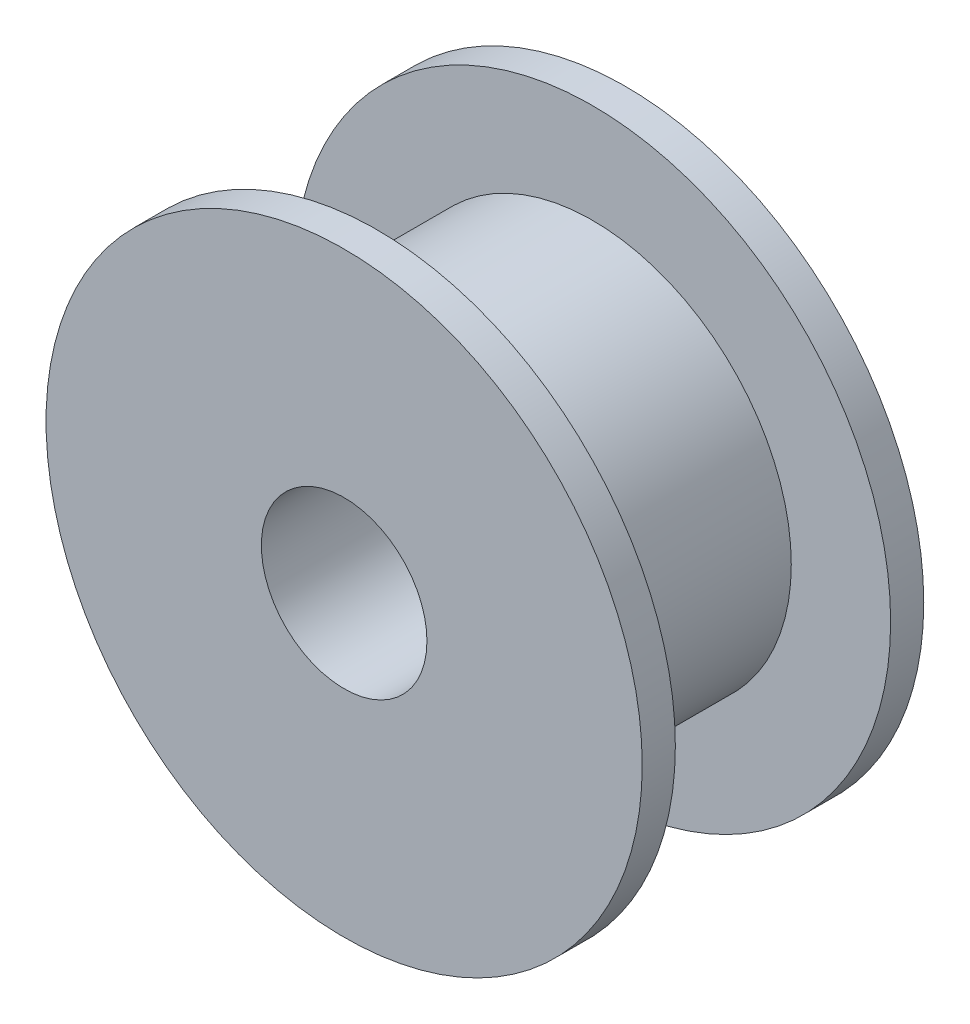
ISO-10303-21;
HEADER;
FILE_DESCRIPTION(('STEP AP214'),'2;1');
FILE_NAME('part.step','',(''),(''),'','','');
FILE_SCHEMA(('AUTOMOTIVE_DESIGN { 1 0 10303 214 1 1 1 1 }'));
ENDSEC;
DATA;
#1=APPLICATION_CONTEXT('core data for automotive mechanical design processes');
#2=APPLICATION_PROTOCOL_DEFINITION('international standard','automotive_design',2000,#1);
#3=PRODUCT_CONTEXT('',#1,'mechanical');
#4=PRODUCT('Part','Part','',(#3));
#5=PRODUCT_RELATED_PRODUCT_CATEGORY('part','',(#4));
#6=PRODUCT_DEFINITION_FORMATION('','',#4);
#7=PRODUCT_DEFINITION_CONTEXT('part definition',#1,'design');
#8=PRODUCT_DEFINITION('design','',#6,#7);
#9=PRODUCT_DEFINITION_SHAPE('','',#8);
#10=(LENGTH_UNIT() NAMED_UNIT(*) SI_UNIT(.MILLI.,.METRE.));
#11=(NAMED_UNIT(*) PLANE_ANGLE_UNIT() SI_UNIT($,.RADIAN.));
#12=(NAMED_UNIT(*) SI_UNIT($,.STERADIAN.) SOLID_ANGLE_UNIT());
#13=UNCERTAINTY_MEASURE_WITH_UNIT(LENGTH_MEASURE(1.E-05),#10,'distance_accuracy_value','');
#14=(GEOMETRIC_REPRESENTATION_CONTEXT(3) GLOBAL_UNCERTAINTY_ASSIGNED_CONTEXT((#13)) GLOBAL_UNIT_ASSIGNED_CONTEXT((#10,
#11,#12)) REPRESENTATION_CONTEXT('',''));
#15=CARTESIAN_POINT('',(0.,0.,0.));
#16=DIRECTION('',(0.,0.,1.));
#17=DIRECTION('',(1.,0.,0.));
#18=AXIS2_PLACEMENT_3D('',#15,#16,#17);
#19=CARTESIAN_POINT('',(2.5,0.,0.));
#20=DIRECTION('',(0.,0.,1.));
#21=DIRECTION('',(1.,0.,0.));
#22=AXIS2_PLACEMENT_3D('',#19,#20,#21);
#23=PLANE('',#22);
#24=CARTESIAN_POINT('',(0.,0.,0.));
#25=DIRECTION('',(0.,0.,1.));
#26=DIRECTION('',(1.,0.,0.));
#27=AXIS2_PLACEMENT_3D('',#24,#25,#26);
#28=CIRCLE('',#27,9.);
#29=CARTESIAN_POINT('',(9.,0.,0.));
#30=VERTEX_POINT('',#29);
#31=EDGE_CURVE('E10',#30,#30,#28,.T.);
#32=ORIENTED_EDGE('',*,*,#31,.T.);
#33=EDGE_LOOP('',(#32));
#34=FACE_BOUND('',#33,.T.);
#35=CARTESIAN_POINT('',(0.,0.,0.));
#36=DIRECTION('',(0.,0.,1.));
#37=DIRECTION('',(1.,0.,0.));
#38=AXIS2_PLACEMENT_3D('',#35,#36,#37);
#39=CIRCLE('',#38,2.5);
#40=CARTESIAN_POINT('',(2.5,0.,0.));
#41=VERTEX_POINT('',#40);
#42=EDGE_CURVE('E59',#41,#41,#39,.T.);
#43=ORIENTED_EDGE('',*,*,#42,.F.);
#44=EDGE_LOOP('',(#43));
#45=FACE_BOUND('',#44,.T.);
#46=ADVANCED_FACE('F31',(#34,#45),#23,.T.);
#47=CARTESIAN_POINT('',(0.,0.,0.));
#48=DIRECTION('',(0.,0.,1.));
#49=DIRECTION('',(1.,0.,0.));
#50=AXIS2_PLACEMENT_3D('',#47,#48,#49);
#51=CYLINDRICAL_SURFACE('',#50,9.);
#52=CARTESIAN_POINT('',(0.,0.,-1.));
#53=DIRECTION('',(0.,0.,1.));
#54=DIRECTION('',(1.,0.,0.));
#55=AXIS2_PLACEMENT_3D('',#52,#53,#54);
#56=CIRCLE('',#55,9.);
#57=CARTESIAN_POINT('',(9.,0.,-1.));
#58=VERTEX_POINT('',#57);
#59=EDGE_CURVE('E37',#58,#58,#56,.T.);
#60=ORIENTED_EDGE('',*,*,#59,.T.);
#61=EDGE_LOOP('',(#60));
#62=FACE_BOUND('',#61,.T.);
#63=ORIENTED_EDGE('',*,*,#31,.F.);
#64=EDGE_LOOP('',(#63));
#65=FACE_BOUND('',#64,.T.);
#66=ADVANCED_FACE('F67',(#62,#65),#51,.T.);
#67=CARTESIAN_POINT('',(9.,0.,-1.));
#68=DIRECTION('',(0.,0.,-1.));
#69=DIRECTION('',(-1.,0.,0.));
#70=AXIS2_PLACEMENT_3D('',#67,#68,#69);
#71=PLANE('',#70);
#72=CARTESIAN_POINT('',(0.,0.,-1.));
#73=DIRECTION('',(0.,0.,1.));
#74=DIRECTION('',(1.,0.,0.));
#75=AXIS2_PLACEMENT_3D('',#72,#73,#74);
#76=CIRCLE('',#75,6.);
#77=CARTESIAN_POINT('',(6.,0.,-1.));
#78=VERTEX_POINT('',#77);
#79=EDGE_CURVE('E41',#78,#78,#76,.T.);
#80=ORIENTED_EDGE('',*,*,#79,.T.);
#81=EDGE_LOOP('',(#80));
#82=FACE_BOUND('',#81,.T.);
#83=ORIENTED_EDGE('',*,*,#59,.F.);
#84=EDGE_LOOP('',(#83));
#85=FACE_BOUND('',#84,.T.);
#86=ADVANCED_FACE('F71',(#82,#85),#71,.T.);
#87=CARTESIAN_POINT('',(0.,0.,0.));
#88=DIRECTION('',(0.,0.,1.));
#89=DIRECTION('',(1.,0.,0.));
#90=AXIS2_PLACEMENT_3D('',#87,#88,#89);
#91=CYLINDRICAL_SURFACE('',#90,6.);
#92=CARTESIAN_POINT('',(0.,0.,-7.5));
#93=DIRECTION('',(0.,0.,1.));
#94=DIRECTION('',(1.,0.,0.));
#95=AXIS2_PLACEMENT_3D('',#92,#93,#94);
#96=CIRCLE('',#95,6.);
#97=CARTESIAN_POINT('',(6.,0.,-7.5));
#98=VERTEX_POINT('',#97);
#99=EDGE_CURVE('E45',#98,#98,#96,.T.);
#100=ORIENTED_EDGE('',*,*,#99,.T.);
#101=EDGE_LOOP('',(#100));
#102=FACE_BOUND('',#101,.T.);
#103=ORIENTED_EDGE('',*,*,#79,.F.);
#104=EDGE_LOOP('',(#103));
#105=FACE_BOUND('',#104,.T.);
#106=ADVANCED_FACE('F75',(#102,#105),#91,.T.);
#107=CARTESIAN_POINT('',(6.,0.,-7.5));
#108=DIRECTION('',(0.,0.,1.));
#109=DIRECTION('',(1.,0.,0.));
#110=AXIS2_PLACEMENT_3D('',#107,#108,#109);
#111=PLANE('',#110);
#112=CARTESIAN_POINT('',(0.,0.,-7.5));
#113=DIRECTION('',(0.,0.,1.));
#114=DIRECTION('',(1.,0.,0.));
#115=AXIS2_PLACEMENT_3D('',#112,#113,#114);
#116=CIRCLE('',#115,9.);
#117=CARTESIAN_POINT('',(9.,0.,-7.5));
#118=VERTEX_POINT('',#117);
#119=EDGE_CURVE('E50',#118,#118,#116,.T.);
#120=ORIENTED_EDGE('',*,*,#119,.T.);
#121=EDGE_LOOP('',(#120));
#122=FACE_BOUND('',#121,.T.);
#123=ORIENTED_EDGE('',*,*,#99,.F.);
#124=EDGE_LOOP('',(#123));
#125=FACE_BOUND('',#124,.T.);
#126=ADVANCED_FACE('F82',(#122,#125),#111,.T.);
#127=CARTESIAN_POINT('',(0.,0.,0.));
#128=DIRECTION('',(0.,0.,1.));
#129=DIRECTION('',(1.,0.,0.));
#130=AXIS2_PLACEMENT_3D('',#127,#128,#129);
#131=CYLINDRICAL_SURFACE('',#130,9.);
#132=CARTESIAN_POINT('',(0.,0.,-8.5));
#133=DIRECTION('',(0.,0.,1.));
#134=DIRECTION('',(1.,0.,0.));
#135=AXIS2_PLACEMENT_3D('',#132,#133,#134);
#136=CIRCLE('',#135,9.);
#137=CARTESIAN_POINT('',(9.,0.,-8.5));
#138=VERTEX_POINT('',#137);
#139=EDGE_CURVE('E53',#138,#138,#136,.T.);
#140=ORIENTED_EDGE('',*,*,#139,.T.);
#141=EDGE_LOOP('',(#140));
#142=FACE_BOUND('',#141,.T.);
#143=ORIENTED_EDGE('',*,*,#119,.F.);
#144=EDGE_LOOP('',(#143));
#145=FACE_BOUND('',#144,.T.);
#146=ADVANCED_FACE('F86',(#142,#145),#131,.T.);
#147=CARTESIAN_POINT('',(9.,0.,-8.5));
#148=DIRECTION('',(0.,0.,-1.));
#149=DIRECTION('',(-1.,0.,0.));
#150=AXIS2_PLACEMENT_3D('',#147,#148,#149);
#151=PLANE('',#150);
#152=CARTESIAN_POINT('',(0.,0.,-8.5));
#153=DIRECTION('',(0.,0.,1.));
#154=DIRECTION('',(1.,0.,0.));
#155=AXIS2_PLACEMENT_3D('',#152,#153,#154);
#156=CIRCLE('',#155,2.5);
#157=CARTESIAN_POINT('',(2.5,0.,-8.5));
#158=VERTEX_POINT('',#157);
#159=EDGE_CURVE('E56',#158,#158,#156,.T.);
#160=ORIENTED_EDGE('',*,*,#159,.T.);
#161=EDGE_LOOP('',(#160));
#162=FACE_BOUND('',#161,.T.);
#163=ORIENTED_EDGE('',*,*,#139,.F.);
#164=EDGE_LOOP('',(#163));
#165=FACE_BOUND('',#164,.T.);
#166=ADVANCED_FACE('F90',(#162,#165),#151,.T.);
#167=CARTESIAN_POINT('',(0.,0.,0.));
#168=DIRECTION('',(0.,0.,1.));
#169=DIRECTION('',(1.,0.,0.));
#170=AXIS2_PLACEMENT_3D('',#167,#168,#169);
#171=CYLINDRICAL_SURFACE('',#170,2.5);
#172=ORIENTED_EDGE('',*,*,#42,.T.);
#173=EDGE_LOOP('',(#172));
#174=FACE_BOUND('',#173,.T.);
#175=ORIENTED_EDGE('',*,*,#159,.F.);
#176=EDGE_LOOP('',(#175));
#177=FACE_BOUND('',#176,.T.);
#178=ADVANCED_FACE('F63',(#174,#177),#171,.F.);
#179=CLOSED_SHELL('',(#46,#66,#86,#106,#126,#146,#166,#178));
#180=MANIFOLD_SOLID_BREP('B2',#179);
#181=ADVANCED_BREP_SHAPE_REPRESENTATION('',(#18,#180),#14);
#182=SHAPE_DEFINITION_REPRESENTATION(#9,#181);
ENDSEC;
END-ISO-10303-21;
